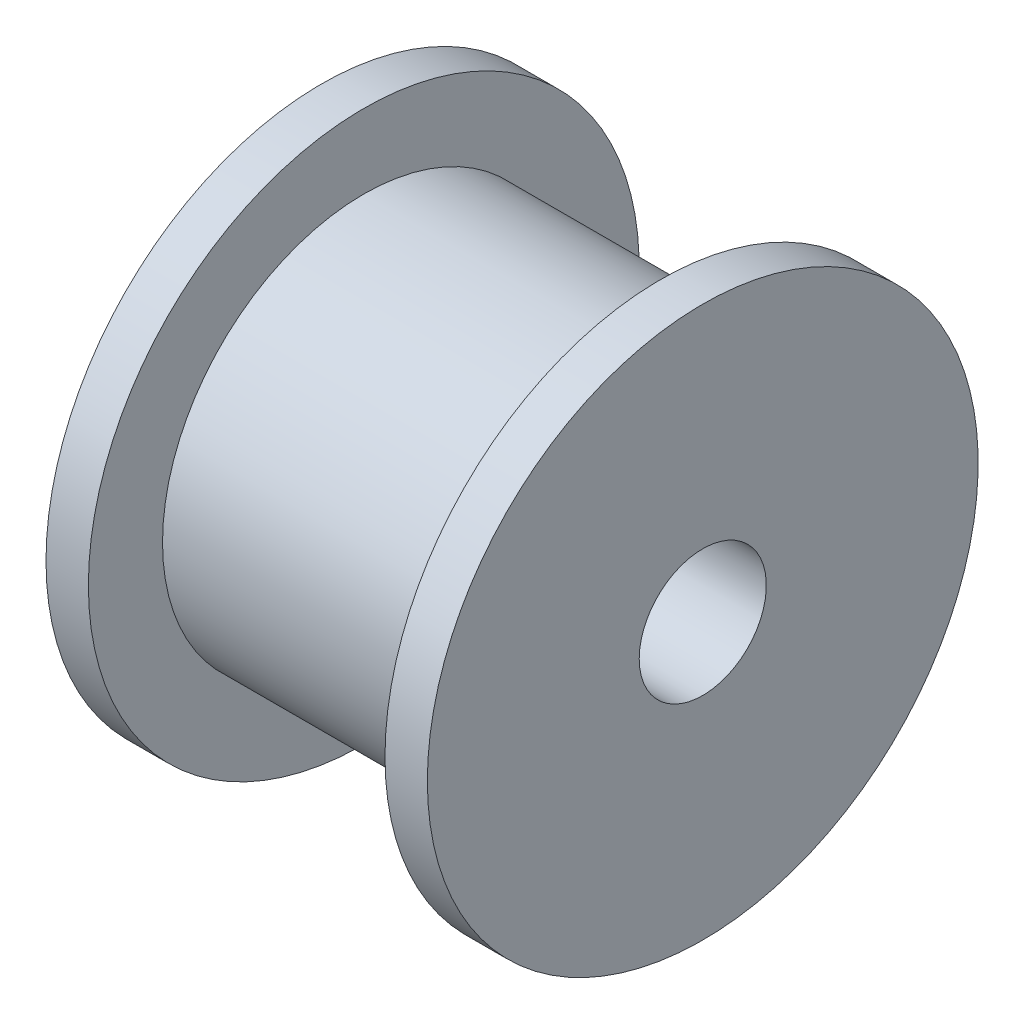
ISO-10303-21;
HEADER;
FILE_DESCRIPTION(('STEP AP214'),'2;1');
FILE_NAME('part.step','',(''),(''),'','','');
FILE_SCHEMA(('AUTOMOTIVE_DESIGN { 1 0 10303 214 1 1 1 1 }'));
ENDSEC;
DATA;
#1=APPLICATION_CONTEXT('core data for automotive mechanical design processes');
#2=APPLICATION_PROTOCOL_DEFINITION('international standard','automotive_design',2000,#1);
#3=PRODUCT_CONTEXT('',#1,'mechanical');
#4=PRODUCT('Part','Part','',(#3));
#5=PRODUCT_RELATED_PRODUCT_CATEGORY('part','',(#4));
#6=PRODUCT_DEFINITION_FORMATION('','',#4);
#7=PRODUCT_DEFINITION_CONTEXT('part definition',#1,'design');
#8=PRODUCT_DEFINITION('design','',#6,#7);
#9=PRODUCT_DEFINITION_SHAPE('','',#8);
#10=(LENGTH_UNIT() NAMED_UNIT(*) SI_UNIT(.MILLI.,.METRE.));
#11=(NAMED_UNIT(*) PLANE_ANGLE_UNIT() SI_UNIT($,.RADIAN.));
#12=(NAMED_UNIT(*) SI_UNIT($,.STERADIAN.) SOLID_ANGLE_UNIT());
#13=UNCERTAINTY_MEASURE_WITH_UNIT(LENGTH_MEASURE(1.E-05),#10,'distance_accuracy_value','');
#14=(GEOMETRIC_REPRESENTATION_CONTEXT(3) GLOBAL_UNCERTAINTY_ASSIGNED_CONTEXT((#13)) GLOBAL_UNIT_ASSIGNED_CONTEXT((#10,
#11,#12)) REPRESENTATION_CONTEXT('',''));
#15=CARTESIAN_POINT('',(0.,0.,0.));
#16=DIRECTION('',(0.,0.,1.));
#17=DIRECTION('',(1.,0.,0.));
#18=AXIS2_PLACEMENT_3D('',#15,#16,#17);
#19=CARTESIAN_POINT('',(-3.5,6.5,0.));
#20=DIRECTION('',(-1.,0.,0.));
#21=DIRECTION('',(0.,0.,1.));
#22=AXIS2_PLACEMENT_3D('',#19,#20,#21);
#23=PLANE('',#22);
#24=CARTESIAN_POINT('',(-3.5,0.,0.));
#25=DIRECTION('',(-1.,0.,0.));
#26=DIRECTION('',(0.,0.,1.));
#27=AXIS2_PLACEMENT_3D('',#24,#25,#26);
#28=CIRCLE('',#27,6.5);
#29=CARTESIAN_POINT('',(-3.5,0.,6.5));
#30=VERTEX_POINT('',#29);
#31=EDGE_CURVE('E40',#30,#30,#28,.T.);
#32=ORIENTED_EDGE('',*,*,#31,.F.);
#33=EDGE_LOOP('',(#32));
#34=FACE_BOUND('',#33,.T.);
#35=CARTESIAN_POINT('',(-3.5,0.,0.));
#36=DIRECTION('',(-1.,0.,0.));
#37=DIRECTION('',(0.,0.,1.));
#38=AXIS2_PLACEMENT_3D('',#35,#36,#37);
#39=CIRCLE('',#38,4.75);
#40=CARTESIAN_POINT('',(-3.5,0.,4.75));
#41=VERTEX_POINT('',#40);
#42=EDGE_CURVE('E10',#41,#41,#39,.T.);
#43=ORIENTED_EDGE('',*,*,#42,.T.);
#44=EDGE_LOOP('',(#43));
#45=FACE_BOUND('',#44,.T.);
#46=ADVANCED_FACE('F34',(#34,#45),#23,.F.);
#47=CARTESIAN_POINT('',(-12.2830188679245,0.,0.));
#48=DIRECTION('',(-1.,0.,0.));
#49=DIRECTION('',(0.,0.,1.));
#50=AXIS2_PLACEMENT_3D('',#47,#48,#49);
#51=CYLINDRICAL_SURFACE('',#50,6.5);
#52=CARTESIAN_POINT('',(-4.5,0.,0.));
#53=DIRECTION('',(-1.,0.,0.));
#54=DIRECTION('',(0.,0.,1.));
#55=AXIS2_PLACEMENT_3D('',#52,#53,#54);
#56=CIRCLE('',#55,6.5);
#57=CARTESIAN_POINT('',(-4.5,0.,6.5));
#58=VERTEX_POINT('',#57);
#59=EDGE_CURVE('E44',#58,#58,#56,.T.);
#60=ORIENTED_EDGE('',*,*,#59,.F.);
#61=EDGE_LOOP('',(#60));
#62=FACE_BOUND('',#61,.T.);
#63=ORIENTED_EDGE('',*,*,#31,.T.);
#64=EDGE_LOOP('',(#63));
#65=FACE_BOUND('',#64,.T.);
#66=ADVANCED_FACE('F95',(#62,#65),#51,.T.);
#67=CARTESIAN_POINT('',(-4.5,1.5,0.));
#68=DIRECTION('',(1.,0.,0.));
#69=DIRECTION('',(0.,0.,-1.));
#70=AXIS2_PLACEMENT_3D('',#67,#68,#69);
#71=PLANE('',#70);
#72=CARTESIAN_POINT('',(-4.5,0.,0.));
#73=DIRECTION('',(-1.,0.,0.));
#74=DIRECTION('',(0.,0.,1.));
#75=AXIS2_PLACEMENT_3D('',#72,#73,#74);
#76=CIRCLE('',#75,1.5);
#77=CARTESIAN_POINT('',(-4.5,0.,1.5));
#78=VERTEX_POINT('',#77);
#79=EDGE_CURVE('E48',#78,#78,#76,.T.);
#80=ORIENTED_EDGE('',*,*,#79,.F.);
#81=EDGE_LOOP('',(#80));
#82=FACE_BOUND('',#81,.T.);
#83=ORIENTED_EDGE('',*,*,#59,.T.);
#84=EDGE_LOOP('',(#83));
#85=FACE_BOUND('',#84,.T.);
#86=ADVANCED_FACE('F89',(#82,#85),#71,.F.);
#87=CARTESIAN_POINT('',(-12.2830188679245,0.,0.));
#88=DIRECTION('',(-1.,0.,0.));
#89=DIRECTION('',(0.,0.,1.));
#90=AXIS2_PLACEMENT_3D('',#87,#88,#89);
#91=CYLINDRICAL_SURFACE('',#90,1.5);
#92=CARTESIAN_POINT('',(4.5,0.,0.));
#93=DIRECTION('',(-1.,0.,0.));
#94=DIRECTION('',(0.,0.,1.));
#95=AXIS2_PLACEMENT_3D('',#92,#93,#94);
#96=CIRCLE('',#95,1.5);
#97=CARTESIAN_POINT('',(4.5,0.,1.5));
#98=VERTEX_POINT('',#97);
#99=EDGE_CURVE('E53',#98,#98,#96,.T.);
#100=ORIENTED_EDGE('',*,*,#99,.F.);
#101=EDGE_LOOP('',(#100));
#102=FACE_BOUND('',#101,.T.);
#103=ORIENTED_EDGE('',*,*,#79,.T.);
#104=EDGE_LOOP('',(#103));
#105=FACE_BOUND('',#104,.T.);
#106=ADVANCED_FACE('F83',(#102,#105),#91,.F.);
#107=CARTESIAN_POINT('',(4.5,6.5,0.));
#108=DIRECTION('',(-1.,0.,0.));
#109=DIRECTION('',(0.,0.,1.));
#110=AXIS2_PLACEMENT_3D('',#107,#108,#109);
#111=PLANE('',#110);
#112=CARTESIAN_POINT('',(4.5,0.,0.));
#113=DIRECTION('',(-1.,0.,0.));
#114=DIRECTION('',(0.,0.,1.));
#115=AXIS2_PLACEMENT_3D('',#112,#113,#114);
#116=CIRCLE('',#115,6.5);
#117=CARTESIAN_POINT('',(4.5,0.,6.5));
#118=VERTEX_POINT('',#117);
#119=EDGE_CURVE('E56',#118,#118,#116,.T.);
#120=ORIENTED_EDGE('',*,*,#119,.F.);
#121=EDGE_LOOP('',(#120));
#122=FACE_BOUND('',#121,.T.);
#123=ORIENTED_EDGE('',*,*,#99,.T.);
#124=EDGE_LOOP('',(#123));
#125=FACE_BOUND('',#124,.T.);
#126=ADVANCED_FACE('F77',(#122,#125),#111,.F.);
#127=CARTESIAN_POINT('',(-12.2830188679245,0.,0.));
#128=DIRECTION('',(-1.,0.,0.));
#129=DIRECTION('',(0.,0.,1.));
#130=AXIS2_PLACEMENT_3D('',#127,#128,#129);
#131=CYLINDRICAL_SURFACE('',#130,6.5);
#132=CARTESIAN_POINT('',(3.5,0.,0.));
#133=DIRECTION('',(-1.,0.,0.));
#134=DIRECTION('',(0.,0.,1.));
#135=AXIS2_PLACEMENT_3D('',#132,#133,#134);
#136=CIRCLE('',#135,6.5);
#137=CARTESIAN_POINT('',(3.5,0.,6.5));
#138=VERTEX_POINT('',#137);
#139=EDGE_CURVE('E59',#138,#138,#136,.T.);
#140=ORIENTED_EDGE('',*,*,#139,.F.);
#141=EDGE_LOOP('',(#140));
#142=FACE_BOUND('',#141,.T.);
#143=ORIENTED_EDGE('',*,*,#119,.T.);
#144=EDGE_LOOP('',(#143));
#145=FACE_BOUND('',#144,.T.);
#146=ADVANCED_FACE('F71',(#142,#145),#131,.T.);
#147=CARTESIAN_POINT('',(3.5,4.75,0.));
#148=DIRECTION('',(1.,0.,0.));
#149=DIRECTION('',(0.,0.,-1.));
#150=AXIS2_PLACEMENT_3D('',#147,#148,#149);
#151=PLANE('',#150);
#152=CARTESIAN_POINT('',(3.5,0.,0.));
#153=DIRECTION('',(-1.,0.,0.));
#154=DIRECTION('',(0.,0.,1.));
#155=AXIS2_PLACEMENT_3D('',#152,#153,#154);
#156=CIRCLE('',#155,4.75);
#157=CARTESIAN_POINT('',(3.5,0.,4.75));
#158=VERTEX_POINT('',#157);
#159=EDGE_CURVE('E62',#158,#158,#156,.T.);
#160=ORIENTED_EDGE('',*,*,#159,.F.);
#161=EDGE_LOOP('',(#160));
#162=FACE_BOUND('',#161,.T.);
#163=ORIENTED_EDGE('',*,*,#139,.T.);
#164=EDGE_LOOP('',(#163));
#165=FACE_BOUND('',#164,.T.);
#166=ADVANCED_FACE('F68',(#162,#165),#151,.F.);
#167=CARTESIAN_POINT('',(-12.2830188679245,0.,0.));
#168=DIRECTION('',(-1.,0.,0.));
#169=DIRECTION('',(0.,0.,1.));
#170=AXIS2_PLACEMENT_3D('',#167,#168,#169);
#171=CYLINDRICAL_SURFACE('',#170,4.75);
#172=ORIENTED_EDGE('',*,*,#42,.F.);
#173=EDGE_LOOP('',(#172));
#174=FACE_BOUND('',#173,.T.);
#175=ORIENTED_EDGE('',*,*,#159,.T.);
#176=EDGE_LOOP('',(#175));
#177=FACE_BOUND('',#176,.T.);
#178=ADVANCED_FACE('F66',(#174,#177),#171,.T.);
#179=CLOSED_SHELL('',(#46,#66,#86,#106,#126,#146,#166,#178));
#180=MANIFOLD_SOLID_BREP('B2',#179);
#181=ADVANCED_BREP_SHAPE_REPRESENTATION('',(#18,#180),#14);
#182=SHAPE_DEFINITION_REPRESENTATION(#9,#181);
ENDSEC;
END-ISO-10303-21;
